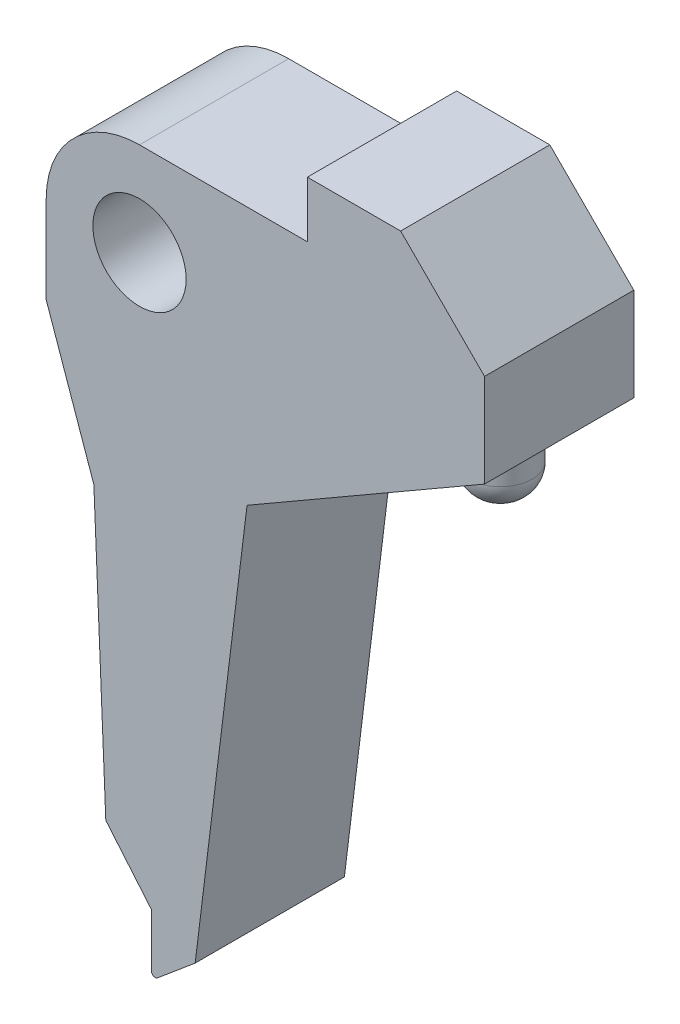
ISO-10303-21;
HEADER;
FILE_DESCRIPTION(('STEP AP214'),'2;1');
FILE_NAME('part.step','',(''),(''),'','','');
FILE_SCHEMA(('AUTOMOTIVE_DESIGN { 1 0 10303 214 1 1 1 1 }'));
ENDSEC;
DATA;
#1=APPLICATION_CONTEXT('core data for automotive mechanical design processes');
#2=APPLICATION_PROTOCOL_DEFINITION('international standard','automotive_design',2000,#1);
#3=PRODUCT_CONTEXT('',#1,'mechanical');
#4=PRODUCT('Part','Part','',(#3));
#5=PRODUCT_RELATED_PRODUCT_CATEGORY('part','',(#4));
#6=PRODUCT_DEFINITION_FORMATION('','',#4);
#7=PRODUCT_DEFINITION_CONTEXT('part definition',#1,'design');
#8=PRODUCT_DEFINITION('design','',#6,#7);
#9=PRODUCT_DEFINITION_SHAPE('','',#8);
#10=(LENGTH_UNIT() NAMED_UNIT(*) SI_UNIT(.MILLI.,.METRE.));
#11=(NAMED_UNIT(*) PLANE_ANGLE_UNIT() SI_UNIT($,.RADIAN.));
#12=(NAMED_UNIT(*) SI_UNIT($,.STERADIAN.) SOLID_ANGLE_UNIT());
#13=UNCERTAINTY_MEASURE_WITH_UNIT(LENGTH_MEASURE(1.E-05),#10,'distance_accuracy_value','');
#14=(GEOMETRIC_REPRESENTATION_CONTEXT(3) GLOBAL_UNCERTAINTY_ASSIGNED_CONTEXT((#13)) GLOBAL_UNIT_ASSIGNED_CONTEXT((#10,
#11,#12)) REPRESENTATION_CONTEXT('',''));
#15=CARTESIAN_POINT('',(0.,0.,0.));
#16=DIRECTION('',(0.,0.,1.));
#17=DIRECTION('',(1.,0.,0.));
#18=AXIS2_PLACEMENT_3D('',#15,#16,#17);
#19=CARTESIAN_POINT('',(0.839599880124929,-33.039815980547,8.));
#20=DIRECTION('',(0.,0.,-1.));
#21=DIRECTION('',(-1.,0.,0.));
#22=AXIS2_PLACEMENT_3D('',#19,#20,#21);
#23=PLANE('',#22);
#24=CARTESIAN_POINT('',(0.839599880124929,-33.039815980547,8.));
#25=DIRECTION('',(0.,0.,1.));
#26=DIRECTION('',(-1.,0.,0.));
#27=AXIS2_PLACEMENT_3D('',#24,#25,#26);
#28=CIRCLE('',#27,0.199999999999998);
#29=CARTESIAN_POINT('',(0.639599880124929,-33.039815980547,8.));
#30=VERTEX_POINT('',#29);
#31=CARTESIAN_POINT('',(0.968172025400115,-33.1930125975441,8.));
#32=VERTEX_POINT('',#31);
#33=EDGE_CURVE('E204',#30,#32,#28,.T.);
#34=ORIENTED_EDGE('',*,*,#33,.T.);
#35=DIRECTION('',(0.76598308498519,0.642860726375917,0.));
#36=VECTOR('',#35,1.);
#37=CARTESIAN_POINT('',(2.98543479971255,-31.5,8.));
#38=LINE('',#37,#36);
#39=CARTESIAN_POINT('',(2.98543479971255,-31.5,8.));
#40=VERTEX_POINT('',#39);
#41=EDGE_CURVE('E115',#32,#40,#38,.T.);
#42=ORIENTED_EDGE('',*,*,#41,.T.);
#43=DIRECTION('',(0.121869343405141,0.992546151641323,0.));
#44=VECTOR('',#43,1.);
#45=CARTESIAN_POINT('',(4.50077000284838,-19.1585851511559,8.));
#46=LINE('',#45,#44);
#47=CARTESIAN_POINT('',(5.76628220120397,-8.85181539891966,8.));
#48=VERTEX_POINT('',#47);
#49=EDGE_CURVE('E327',#40,#48,#46,.T.);
#50=ORIENTED_EDGE('',*,*,#49,.T.);
#51=DIRECTION('',(0.866025403784439,0.5,0.));
#52=VECTOR('',#51,1.);
#53=CARTESIAN_POINT('',(5.76628220120397,-8.85181539891966,8.));
#54=LINE('',#53,#52);
#55=CARTESIAN_POINT('',(18.5,-1.5,8.));
#56=VERTEX_POINT('',#55);
#57=EDGE_CURVE('E329',#48,#56,#54,.T.);
#58=ORIENTED_EDGE('',*,*,#57,.T.);
#59=DIRECTION('',(0.,1.,0.));
#60=VECTOR('',#59,1.);
#61=CARTESIAN_POINT('',(18.5,3.5,8.));
#62=LINE('',#61,#60);
#63=CARTESIAN_POINT('',(18.5,3.5,8.));
#64=VERTEX_POINT('',#63);
#65=EDGE_CURVE('E331',#56,#64,#62,.T.);
#66=ORIENTED_EDGE('',*,*,#65,.T.);
#67=DIRECTION('',(-0.707106781186551,0.707106781186544,0.));
#68=VECTOR('',#67,1.);
#69=CARTESIAN_POINT('',(14.,8.,8.));
#70=LINE('',#69,#68);
#71=CARTESIAN_POINT('',(14.,8.,8.));
#72=VERTEX_POINT('',#71);
#73=EDGE_CURVE('E337',#64,#72,#70,.T.);
#74=ORIENTED_EDGE('',*,*,#73,.T.);
#75=DIRECTION('',(-1.,0.,0.));
#76=VECTOR('',#75,1.);
#77=CARTESIAN_POINT('',(9.,8.,8.));
#78=LINE('',#77,#76);
#79=CARTESIAN_POINT('',(9.,8.,8.));
#80=VERTEX_POINT('',#79);
#81=EDGE_CURVE('E339',#72,#80,#78,.T.);
#82=ORIENTED_EDGE('',*,*,#81,.T.);
#83=DIRECTION('',(0.,-1.,0.));
#84=VECTOR('',#83,1.);
#85=CARTESIAN_POINT('',(9.,5.,8.));
#86=LINE('',#85,#84);
#87=CARTESIAN_POINT('',(9.,5.,8.));
#88=VERTEX_POINT('',#87);
#89=EDGE_CURVE('E341',#80,#88,#86,.T.);
#90=ORIENTED_EDGE('',*,*,#89,.T.);
#91=DIRECTION('',(-1.,0.,0.));
#92=VECTOR('',#91,1.);
#93=CARTESIAN_POINT('',(0.,5.,8.));
#94=LINE('',#93,#92);
#95=CARTESIAN_POINT('',(0.,5.,8.));
#96=VERTEX_POINT('',#95);
#97=EDGE_CURVE('E343',#88,#96,#94,.T.);
#98=ORIENTED_EDGE('',*,*,#97,.T.);
#99=CARTESIAN_POINT('',(0.,0.,8.));
#100=DIRECTION('',(0.,0.,1.));
#101=DIRECTION('',(1.,0.,0.));
#102=AXIS2_PLACEMENT_3D('',#99,#100,#101);
#103=CIRCLE('',#102,5.);
#104=CARTESIAN_POINT('',(-5.,0.,8.));
#105=VERTEX_POINT('',#104);
#106=EDGE_CURVE('E345',#96,#105,#103,.T.);
#107=ORIENTED_EDGE('',*,*,#106,.T.);
#108=DIRECTION('',(0.,-1.,0.));
#109=VECTOR('',#108,1.);
#110=CARTESIAN_POINT('',(-5.,-4.69657413374414,8.));
#111=LINE('',#110,#109);
#112=CARTESIAN_POINT('',(-5.,-4.69657413374414,8.));
#113=VERTEX_POINT('',#112);
#114=EDGE_CURVE('E347',#105,#113,#111,.T.);
#115=ORIENTED_EDGE('',*,*,#114,.T.);
#116=DIRECTION('',(0.330146334418636,-0.943929763208014,0.));
#117=VECTOR('',#116,1.);
#118=CARTESIAN_POINT('',(-2.44557341825096,-12.,8.));
#119=LINE('',#118,#117);
#120=CARTESIAN_POINT('',(-2.44557341825096,-12.,8.));
#121=VERTEX_POINT('',#120);
#122=EDGE_CURVE('E155',#113,#121,#119,.T.);
#123=ORIENTED_EDGE('',*,*,#122,.T.);
#124=DIRECTION('',(0.0418663292683817,-0.999123220865971,0.));
#125=VECTOR('',#124,1.);
#126=CARTESIAN_POINT('',(-1.8057349141197,-27.2694902622974,8.));
#127=LINE('',#126,#125);
#128=CARTESIAN_POINT('',(-1.8057349141197,-27.2694902622974,8.));
#129=VERTEX_POINT('',#128);
#130=EDGE_CURVE('E149',#121,#129,#127,.T.);
#131=ORIENTED_EDGE('',*,*,#130,.T.);
#132=DIRECTION('',(0.642787609686544,-0.766044443118974,0.));
#133=VECTOR('',#132,1.);
#134=CARTESIAN_POINT('',(0.639599880124929,-30.183726788434,8.));
#135=LINE('',#134,#133);
#136=CARTESIAN_POINT('',(0.639599880124929,-30.183726788434,8.));
#137=VERTEX_POINT('',#136);
#138=EDGE_CURVE('E153',#129,#137,#135,.T.);
#139=ORIENTED_EDGE('',*,*,#138,.T.);
#140=DIRECTION('',(0.,-1.,0.));
#141=VECTOR('',#140,1.);
#142=CARTESIAN_POINT('',(0.639599880124929,-33.039815980547,8.));
#143=LINE('',#142,#141);
#144=EDGE_CURVE('E50',#137,#30,#143,.T.);
#145=ORIENTED_EDGE('',*,*,#144,.T.);
#146=EDGE_LOOP('',(#34,#42,#50,#58,#66,#74,#82,#90,#98,#107,#115,#123,#131,#139,#145));
#147=FACE_BOUND('',#146,.T.);
#148=CARTESIAN_POINT('',(0.,0.,8.));
#149=DIRECTION('',(0.,0.,1.));
#150=DIRECTION('',(1.,0.,0.));
#151=AXIS2_PLACEMENT_3D('',#148,#149,#150);
#152=CIRCLE('',#151,2.5);
#153=CARTESIAN_POINT('',(2.5,0.,8.));
#154=VERTEX_POINT('',#153);
#155=EDGE_CURVE('E177',#154,#154,#152,.T.);
#156=ORIENTED_EDGE('',*,*,#155,.F.);
#157=EDGE_LOOP('',(#156));
#158=FACE_BOUND('',#157,.T.);
#159=ADVANCED_FACE('F33',(#147,#158),#23,.F.);
#160=CARTESIAN_POINT('',(0.839599880124929,-33.039815980547,0.));
#161=DIRECTION('',(0.,0.,-1.));
#162=DIRECTION('',(-1.,0.,0.));
#163=AXIS2_PLACEMENT_3D('',#160,#161,#162);
#164=PLANE('',#163);
#165=CARTESIAN_POINT('',(0.839599880124929,-33.039815980547,0.));
#166=DIRECTION('',(0.,0.,1.));
#167=DIRECTION('',(-1.,0.,0.));
#168=AXIS2_PLACEMENT_3D('',#165,#166,#167);
#169=CIRCLE('',#168,0.199999999999998);
#170=CARTESIAN_POINT('',(0.639599880124929,-33.039815980547,0.));
#171=VERTEX_POINT('',#170);
#172=CARTESIAN_POINT('',(0.968172025400115,-33.1930125975441,0.));
#173=VERTEX_POINT('',#172);
#174=EDGE_CURVE('E173',#171,#173,#169,.T.);
#175=ORIENTED_EDGE('',*,*,#174,.F.);
#176=DIRECTION('',(0.,-1.,0.));
#177=VECTOR('',#176,1.);
#178=CARTESIAN_POINT('',(0.639599880124929,-33.039815980547,0.));
#179=LINE('',#178,#177);
#180=CARTESIAN_POINT('',(0.639599880124929,-30.183726788434,0.));
#181=VERTEX_POINT('',#180);
#182=EDGE_CURVE('E106',#181,#171,#179,.T.);
#183=ORIENTED_EDGE('',*,*,#182,.F.);
#184=DIRECTION('',(0.642787609686544,-0.766044443118974,0.));
#185=VECTOR('',#184,1.);
#186=CARTESIAN_POINT('',(0.639599880124929,-30.183726788434,0.));
#187=LINE('',#186,#185);
#188=CARTESIAN_POINT('',(-1.8057349141197,-27.2694902622974,0.));
#189=VERTEX_POINT('',#188);
#190=EDGE_CURVE('E100',#189,#181,#187,.T.);
#191=ORIENTED_EDGE('',*,*,#190,.F.);
#192=DIRECTION('',(0.0418663292683817,-0.999123220865971,0.));
#193=VECTOR('',#192,1.);
#194=CARTESIAN_POINT('',(-1.8057349141197,-27.2694902622974,0.));
#195=LINE('',#194,#193);
#196=CARTESIAN_POINT('',(-2.44557341825096,-12.,0.));
#197=VERTEX_POINT('',#196);
#198=EDGE_CURVE('E163',#197,#189,#195,.T.);
#199=ORIENTED_EDGE('',*,*,#198,.F.);
#200=DIRECTION('',(0.330146334418636,-0.943929763208014,0.));
#201=VECTOR('',#200,1.);
#202=CARTESIAN_POINT('',(-2.44557341825096,-12.,0.));
#203=LINE('',#202,#201);
#204=CARTESIAN_POINT('',(-5.,-4.69657413374414,0.));
#205=VERTEX_POINT('',#204);
#206=EDGE_CURVE('E199',#205,#197,#203,.T.);
#207=ORIENTED_EDGE('',*,*,#206,.F.);
#208=DIRECTION('',(0.,-1.,0.));
#209=VECTOR('',#208,1.);
#210=CARTESIAN_POINT('',(-5.,-4.69657413374414,0.));
#211=LINE('',#210,#209);
#212=CARTESIAN_POINT('',(-5.,0.,0.));
#213=VERTEX_POINT('',#212);
#214=EDGE_CURVE('E197',#213,#205,#211,.T.);
#215=ORIENTED_EDGE('',*,*,#214,.F.);
#216=CARTESIAN_POINT('',(0.,0.,0.));
#217=DIRECTION('',(0.,0.,1.));
#218=DIRECTION('',(1.,0.,0.));
#219=AXIS2_PLACEMENT_3D('',#216,#217,#218);
#220=CIRCLE('',#219,5.);
#221=CARTESIAN_POINT('',(0.,5.,0.));
#222=VERTEX_POINT('',#221);
#223=EDGE_CURVE('E195',#222,#213,#220,.T.);
#224=ORIENTED_EDGE('',*,*,#223,.F.);
#225=DIRECTION('',(-1.,0.,0.));
#226=VECTOR('',#225,1.);
#227=CARTESIAN_POINT('',(0.,5.,0.));
#228=LINE('',#227,#226);
#229=CARTESIAN_POINT('',(9.,5.,0.));
#230=VERTEX_POINT('',#229);
#231=EDGE_CURVE('E193',#230,#222,#228,.T.);
#232=ORIENTED_EDGE('',*,*,#231,.F.);
#233=DIRECTION('',(0.,-1.,0.));
#234=VECTOR('',#233,1.);
#235=CARTESIAN_POINT('',(9.,5.,0.));
#236=LINE('',#235,#234);
#237=CARTESIAN_POINT('',(9.,8.,0.));
#238=VERTEX_POINT('',#237);
#239=EDGE_CURVE('E191',#238,#230,#236,.T.);
#240=ORIENTED_EDGE('',*,*,#239,.F.);
#241=DIRECTION('',(-1.,0.,0.));
#242=VECTOR('',#241,1.);
#243=CARTESIAN_POINT('',(9.,8.,0.));
#244=LINE('',#243,#242);
#245=CARTESIAN_POINT('',(14.,8.,0.));
#246=VERTEX_POINT('',#245);
#247=EDGE_CURVE('E189',#246,#238,#244,.T.);
#248=ORIENTED_EDGE('',*,*,#247,.F.);
#249=DIRECTION('',(-0.707106781186551,0.707106781186544,0.));
#250=VECTOR('',#249,1.);
#251=CARTESIAN_POINT('',(14.,8.,0.));
#252=LINE('',#251,#250);
#253=CARTESIAN_POINT('',(18.5,3.5,0.));
#254=VERTEX_POINT('',#253);
#255=EDGE_CURVE('E187',#254,#246,#252,.T.);
#256=ORIENTED_EDGE('',*,*,#255,.F.);
#257=DIRECTION('',(0.,1.,0.));
#258=VECTOR('',#257,1.);
#259=CARTESIAN_POINT('',(18.5,3.5,0.));
#260=LINE('',#259,#258);
#261=CARTESIAN_POINT('',(18.5,-1.5,0.));
#262=VERTEX_POINT('',#261);
#263=EDGE_CURVE('E185',#262,#254,#260,.T.);
#264=ORIENTED_EDGE('',*,*,#263,.F.);
#265=DIRECTION('',(0.866025403784438,0.500000000000002,0.));
#266=VECTOR('',#265,1.);
#267=CARTESIAN_POINT('',(18.5,-1.5,0.));
#268=LINE('',#267,#266);
#269=CARTESIAN_POINT('',(5.76628220120397,-8.85181539891966,0.));
#270=VERTEX_POINT('',#269);
#271=EDGE_CURVE('E183',#270,#262,#268,.T.);
#272=ORIENTED_EDGE('',*,*,#271,.F.);
#273=DIRECTION('',(0.121869343405141,0.992546151641323,0.));
#274=VECTOR('',#273,1.);
#275=CARTESIAN_POINT('',(4.50077000284838,-19.1585851511559,0.));
#276=LINE('',#275,#274);
#277=CARTESIAN_POINT('',(2.98543479971255,-31.5,0.));
#278=VERTEX_POINT('',#277);
#279=EDGE_CURVE('E180',#278,#270,#276,.T.);
#280=ORIENTED_EDGE('',*,*,#279,.F.);
#281=DIRECTION('',(0.76598308498519,0.642860726375917,0.));
#282=VECTOR('',#281,1.);
#283=CARTESIAN_POINT('',(2.98543479971255,-31.5,0.));
#284=LINE('',#283,#282);
#285=EDGE_CURVE('E176',#173,#278,#284,.T.);
#286=ORIENTED_EDGE('',*,*,#285,.F.);
#287=EDGE_LOOP('',(#175,#183,#191,#199,#207,#215,#224,#232,#240,#248,#256,#264,#272,#280,#286));
#288=FACE_BOUND('',#287,.T.);
#289=CARTESIAN_POINT('',(0.,0.,0.));
#290=DIRECTION('',(0.,0.,1.));
#291=DIRECTION('',(1.,0.,0.));
#292=AXIS2_PLACEMENT_3D('',#289,#290,#291);
#293=CIRCLE('',#292,2.5);
#294=CARTESIAN_POINT('',(2.5,0.,0.));
#295=VERTEX_POINT('',#294);
#296=EDGE_CURVE('E373',#295,#295,#293,.T.);
#297=ORIENTED_EDGE('',*,*,#296,.T.);
#298=EDGE_LOOP('',(#297));
#299=FACE_BOUND('',#298,.T.);
#300=ADVANCED_FACE('F256',(#288,#299),#164,.T.);
#301=CARTESIAN_POINT('',(0.839599880124929,-33.039815980547,8.));
#302=DIRECTION('',(0.,0.,-1.));
#303=DIRECTION('',(-1.,0.,0.));
#304=AXIS2_PLACEMENT_3D('',#301,#302,#303);
#305=CYLINDRICAL_SURFACE('',#304,0.199999999999998);
#306=ORIENTED_EDGE('',*,*,#174,.T.);
#307=DIRECTION('',(0.,0.,-1.));
#308=VECTOR('',#307,1.);
#309=CARTESIAN_POINT('',(0.968172025400115,-33.1930125975441,8.));
#310=LINE('',#309,#308);
#311=EDGE_CURVE('E238',#32,#173,#310,.T.);
#312=ORIENTED_EDGE('',*,*,#311,.F.);
#313=ORIENTED_EDGE('',*,*,#33,.F.);
#314=DIRECTION('',(0.,0.,-1.));
#315=VECTOR('',#314,1.);
#316=CARTESIAN_POINT('',(0.639599880124929,-33.039815980547,8.));
#317=LINE('',#316,#315);
#318=EDGE_CURVE('E169',#30,#171,#317,.T.);
#319=ORIENTED_EDGE('',*,*,#318,.T.);
#320=EDGE_LOOP('',(#306,#312,#313,#319));
#321=FACE_BOUND('',#320,.T.);
#322=ADVANCED_FACE('F261',(#321),#305,.T.);
#323=CARTESIAN_POINT('',(2.98543479971255,-31.5,8.));
#324=DIRECTION('',(-0.642860726375917,0.76598308498519,0.));
#325=DIRECTION('',(-0.76598308498519,-0.642860726375917,0.));
#326=AXIS2_PLACEMENT_3D('',#323,#324,#325);
#327=PLANE('',#326);
#328=ORIENTED_EDGE('',*,*,#285,.T.);
#329=DIRECTION('',(0.,0.,-1.));
#330=VECTOR('',#329,1.);
#331=CARTESIAN_POINT('',(2.98543479971255,-31.5,8.));
#332=LINE('',#331,#330);
#333=EDGE_CURVE('E235',#40,#278,#332,.T.);
#334=ORIENTED_EDGE('',*,*,#333,.F.);
#335=ORIENTED_EDGE('',*,*,#41,.F.);
#336=ORIENTED_EDGE('',*,*,#311,.T.);
#337=EDGE_LOOP('',(#328,#334,#335,#336));
#338=FACE_BOUND('',#337,.T.);
#339=ADVANCED_FACE('F314',(#338),#327,.F.);
#340=CARTESIAN_POINT('',(4.50077000284838,-19.1585851511559,8.));
#341=DIRECTION('',(-0.992546151641323,0.121869343405141,0.));
#342=DIRECTION('',(-0.121869343405141,-0.992546151641323,0.));
#343=AXIS2_PLACEMENT_3D('',#340,#341,#342);
#344=PLANE('',#343);
#345=ORIENTED_EDGE('',*,*,#279,.T.);
#346=DIRECTION('',(0.,0.,-1.));
#347=VECTOR('',#346,1.);
#348=CARTESIAN_POINT('',(5.76628220120397,-8.85181539891966,8.));
#349=LINE('',#348,#347);
#350=EDGE_CURVE('E232',#48,#270,#349,.T.);
#351=ORIENTED_EDGE('',*,*,#350,.F.);
#352=ORIENTED_EDGE('',*,*,#49,.F.);
#353=ORIENTED_EDGE('',*,*,#333,.T.);
#354=EDGE_LOOP('',(#345,#351,#352,#353));
#355=FACE_BOUND('',#354,.T.);
#356=ADVANCED_FACE('F310',(#355),#344,.F.);
#357=CARTESIAN_POINT('',(18.5,-1.5,8.));
#358=DIRECTION('',(-0.500000000000002,0.866025403784438,0.));
#359=DIRECTION('',(-0.866025403784438,-0.500000000000002,0.));
#360=AXIS2_PLACEMENT_3D('',#357,#358,#359);
#361=PLANE('',#360);
#362=CARTESIAN_POINT('',(15.3496087592222,-3.31887923091571,4.));
#363=DIRECTION('',(-0.500000000000002,0.866025403784438,0.));
#364=DIRECTION('',(0.866025403784438,0.500000000000002,0.));
#365=AXIS2_PLACEMENT_3D('',#362,#363,#364);
#366=ELLIPSE('',#365,2.88675134594813,2.5);
#367=CARTESIAN_POINT('',(17.8496087592222,-1.87550355794164,4.));
#368=VERTEX_POINT('',#367);
#369=EDGE_CURVE('E376',#368,#368,#366,.F.);
#370=ORIENTED_EDGE('',*,*,#369,.F.);
#371=EDGE_LOOP('',(#370));
#372=FACE_BOUND('',#371,.T.);
#373=ORIENTED_EDGE('',*,*,#271,.T.);
#374=DIRECTION('',(0.,0.,-1.));
#375=VECTOR('',#374,1.);
#376=CARTESIAN_POINT('',(18.5,-1.5,8.));
#377=LINE('',#376,#375);
#378=EDGE_CURVE('E229',#56,#262,#377,.T.);
#379=ORIENTED_EDGE('',*,*,#378,.F.);
#380=ORIENTED_EDGE('',*,*,#57,.F.);
#381=ORIENTED_EDGE('',*,*,#350,.T.);
#382=EDGE_LOOP('',(#373,#379,#380,#381));
#383=FACE_BOUND('',#382,.T.);
#384=ADVANCED_FACE('F306',(#372,#383),#361,.F.);
#385=CARTESIAN_POINT('',(18.5,3.5,8.));
#386=DIRECTION('',(-1.,0.,0.));
#387=DIRECTION('',(0.,0.,1.));
#388=AXIS2_PLACEMENT_3D('',#385,#386,#387);
#389=PLANE('',#388);
#390=ORIENTED_EDGE('',*,*,#263,.T.);
#391=DIRECTION('',(0.,0.,-1.));
#392=VECTOR('',#391,1.);
#393=CARTESIAN_POINT('',(18.5,3.5,8.));
#394=LINE('',#393,#392);
#395=EDGE_CURVE('E226',#64,#254,#394,.T.);
#396=ORIENTED_EDGE('',*,*,#395,.F.);
#397=ORIENTED_EDGE('',*,*,#65,.F.);
#398=ORIENTED_EDGE('',*,*,#378,.T.);
#399=EDGE_LOOP('',(#390,#396,#397,#398));
#400=FACE_BOUND('',#399,.T.);
#401=ADVANCED_FACE('F302',(#400),#389,.F.);
#402=CARTESIAN_POINT('',(14.,8.,8.));
#403=DIRECTION('',(-0.707106781186544,-0.707106781186552,0.));
#404=DIRECTION('',(0.707106781186552,-0.707106781186544,0.));
#405=AXIS2_PLACEMENT_3D('',#402,#403,#404);
#406=PLANE('',#405);
#407=ORIENTED_EDGE('',*,*,#255,.T.);
#408=DIRECTION('',(0.,0.,-1.));
#409=VECTOR('',#408,1.);
#410=CARTESIAN_POINT('',(14.,8.,8.));
#411=LINE('',#410,#409);
#412=EDGE_CURVE('E223',#72,#246,#411,.T.);
#413=ORIENTED_EDGE('',*,*,#412,.F.);
#414=ORIENTED_EDGE('',*,*,#73,.F.);
#415=ORIENTED_EDGE('',*,*,#395,.T.);
#416=EDGE_LOOP('',(#407,#413,#414,#415));
#417=FACE_BOUND('',#416,.T.);
#418=ADVANCED_FACE('F298',(#417),#406,.F.);
#419=CARTESIAN_POINT('',(9.,8.,8.));
#420=DIRECTION('',(0.,-1.,0.));
#421=DIRECTION('',(0.,0.,-1.));
#422=AXIS2_PLACEMENT_3D('',#419,#420,#421);
#423=PLANE('',#422);
#424=ORIENTED_EDGE('',*,*,#247,.T.);
#425=DIRECTION('',(0.,0.,-1.));
#426=VECTOR('',#425,1.);
#427=CARTESIAN_POINT('',(9.,8.,8.));
#428=LINE('',#427,#426);
#429=EDGE_CURVE('E220',#80,#238,#428,.T.);
#430=ORIENTED_EDGE('',*,*,#429,.F.);
#431=ORIENTED_EDGE('',*,*,#81,.F.);
#432=ORIENTED_EDGE('',*,*,#412,.T.);
#433=EDGE_LOOP('',(#424,#430,#431,#432));
#434=FACE_BOUND('',#433,.T.);
#435=ADVANCED_FACE('F294',(#434),#423,.F.);
#436=CARTESIAN_POINT('',(9.,5.,8.));
#437=DIRECTION('',(1.,0.,0.));
#438=DIRECTION('',(0.,0.,-1.));
#439=AXIS2_PLACEMENT_3D('',#436,#437,#438);
#440=PLANE('',#439);
#441=ORIENTED_EDGE('',*,*,#239,.T.);
#442=DIRECTION('',(0.,0.,-1.));
#443=VECTOR('',#442,1.);
#444=CARTESIAN_POINT('',(9.,5.,8.));
#445=LINE('',#444,#443);
#446=EDGE_CURVE('E217',#88,#230,#445,.T.);
#447=ORIENTED_EDGE('',*,*,#446,.F.);
#448=ORIENTED_EDGE('',*,*,#89,.F.);
#449=ORIENTED_EDGE('',*,*,#429,.T.);
#450=EDGE_LOOP('',(#441,#447,#448,#449));
#451=FACE_BOUND('',#450,.T.);
#452=ADVANCED_FACE('F290',(#451),#440,.F.);
#453=CARTESIAN_POINT('',(0.,5.,8.));
#454=DIRECTION('',(0.,-1.,0.));
#455=DIRECTION('',(0.,0.,-1.));
#456=AXIS2_PLACEMENT_3D('',#453,#454,#455);
#457=PLANE('',#456);
#458=ORIENTED_EDGE('',*,*,#231,.T.);
#459=DIRECTION('',(0.,0.,-1.));
#460=VECTOR('',#459,1.);
#461=CARTESIAN_POINT('',(0.,5.,8.));
#462=LINE('',#461,#460);
#463=EDGE_CURVE('E214',#96,#222,#462,.T.);
#464=ORIENTED_EDGE('',*,*,#463,.F.);
#465=ORIENTED_EDGE('',*,*,#97,.F.);
#466=ORIENTED_EDGE('',*,*,#446,.T.);
#467=EDGE_LOOP('',(#458,#464,#465,#466));
#468=FACE_BOUND('',#467,.T.);
#469=ADVANCED_FACE('F286',(#468),#457,.F.);
#470=CARTESIAN_POINT('',(0.,0.,8.));
#471=DIRECTION('',(0.,0.,-1.));
#472=DIRECTION('',(-1.,0.,0.));
#473=AXIS2_PLACEMENT_3D('',#470,#471,#472);
#474=CYLINDRICAL_SURFACE('',#473,5.);
#475=ORIENTED_EDGE('',*,*,#223,.T.);
#476=DIRECTION('',(0.,0.,-1.));
#477=VECTOR('',#476,1.);
#478=CARTESIAN_POINT('',(-5.,0.,8.));
#479=LINE('',#478,#477);
#480=EDGE_CURVE('E211',#105,#213,#479,.T.);
#481=ORIENTED_EDGE('',*,*,#480,.F.);
#482=ORIENTED_EDGE('',*,*,#106,.F.);
#483=ORIENTED_EDGE('',*,*,#463,.T.);
#484=EDGE_LOOP('',(#475,#481,#482,#483));
#485=FACE_BOUND('',#484,.T.);
#486=ADVANCED_FACE('F282',(#485),#474,.T.);
#487=CARTESIAN_POINT('',(-5.,-4.69657413374414,8.));
#488=DIRECTION('',(1.,0.,0.));
#489=DIRECTION('',(0.,0.,-1.));
#490=AXIS2_PLACEMENT_3D('',#487,#488,#489);
#491=PLANE('',#490);
#492=ORIENTED_EDGE('',*,*,#214,.T.);
#493=DIRECTION('',(0.,0.,-1.));
#494=VECTOR('',#493,1.);
#495=CARTESIAN_POINT('',(-5.,-4.69657413374414,8.));
#496=LINE('',#495,#494);
#497=EDGE_CURVE('E208',#113,#205,#496,.T.);
#498=ORIENTED_EDGE('',*,*,#497,.F.);
#499=ORIENTED_EDGE('',*,*,#114,.F.);
#500=ORIENTED_EDGE('',*,*,#480,.T.);
#501=EDGE_LOOP('',(#492,#498,#499,#500));
#502=FACE_BOUND('',#501,.T.);
#503=ADVANCED_FACE('F278',(#502),#491,.F.);
#504=CARTESIAN_POINT('',(-2.44557341825096,-12.,8.));
#505=DIRECTION('',(0.943929763208014,0.330146334418636,0.));
#506=DIRECTION('',(-0.330146334418636,0.943929763208014,0.));
#507=AXIS2_PLACEMENT_3D('',#504,#505,#506);
#508=PLANE('',#507);
#509=ORIENTED_EDGE('',*,*,#206,.T.);
#510=DIRECTION('',(0.,0.,-1.));
#511=VECTOR('',#510,1.);
#512=CARTESIAN_POINT('',(-2.44557341825096,-12.,8.));
#513=LINE('',#512,#511);
#514=EDGE_CURVE('E164',#121,#197,#513,.T.);
#515=ORIENTED_EDGE('',*,*,#514,.F.);
#516=ORIENTED_EDGE('',*,*,#122,.F.);
#517=ORIENTED_EDGE('',*,*,#497,.T.);
#518=EDGE_LOOP('',(#509,#515,#516,#517));
#519=FACE_BOUND('',#518,.T.);
#520=ADVANCED_FACE('F275',(#519),#508,.F.);
#521=CARTESIAN_POINT('',(-1.8057349141197,-27.2694902622974,8.));
#522=DIRECTION('',(0.999123220865971,0.0418663292683817,0.));
#523=DIRECTION('',(-0.0418663292683817,0.999123220865971,0.));
#524=AXIS2_PLACEMENT_3D('',#521,#522,#523);
#525=PLANE('',#524);
#526=ORIENTED_EDGE('',*,*,#198,.T.);
#527=DIRECTION('',(0.,0.,-1.));
#528=VECTOR('',#527,1.);
#529=CARTESIAN_POINT('',(-1.8057349141197,-27.2694902622974,8.));
#530=LINE('',#529,#528);
#531=EDGE_CURVE('E160',#129,#189,#530,.T.);
#532=ORIENTED_EDGE('',*,*,#531,.F.);
#533=ORIENTED_EDGE('',*,*,#130,.F.);
#534=ORIENTED_EDGE('',*,*,#514,.T.);
#535=EDGE_LOOP('',(#526,#532,#533,#534));
#536=FACE_BOUND('',#535,.T.);
#537=ADVANCED_FACE('F161',(#536),#525,.F.);
#538=CARTESIAN_POINT('',(0.639599880124929,-30.183726788434,8.));
#539=DIRECTION('',(0.766044443118974,0.642787609686544,0.));
#540=DIRECTION('',(-0.642787609686544,0.766044443118974,0.));
#541=AXIS2_PLACEMENT_3D('',#538,#539,#540);
#542=PLANE('',#541);
#543=ORIENTED_EDGE('',*,*,#190,.T.);
#544=DIRECTION('',(0.,0.,-1.));
#545=VECTOR('',#544,1.);
#546=CARTESIAN_POINT('',(0.639599880124929,-30.183726788434,8.));
#547=LINE('',#546,#545);
#548=EDGE_CURVE('E165',#137,#181,#547,.T.);
#549=ORIENTED_EDGE('',*,*,#548,.F.);
#550=ORIENTED_EDGE('',*,*,#138,.F.);
#551=ORIENTED_EDGE('',*,*,#531,.T.);
#552=EDGE_LOOP('',(#543,#549,#550,#551));
#553=FACE_BOUND('',#552,.T.);
#554=ADVANCED_FACE('F167',(#553),#542,.F.);
#555=CARTESIAN_POINT('',(0.639599880124929,-33.039815980547,8.));
#556=DIRECTION('',(1.,0.,0.));
#557=DIRECTION('',(0.,0.,-1.));
#558=AXIS2_PLACEMENT_3D('',#555,#556,#557);
#559=PLANE('',#558);
#560=ORIENTED_EDGE('',*,*,#182,.T.);
#561=ORIENTED_EDGE('',*,*,#318,.F.);
#562=ORIENTED_EDGE('',*,*,#144,.F.);
#563=ORIENTED_EDGE('',*,*,#548,.T.);
#564=EDGE_LOOP('',(#560,#561,#562,#563));
#565=FACE_BOUND('',#564,.T.);
#566=ADVANCED_FACE('F268',(#565),#559,.F.);
#567=CARTESIAN_POINT('',(0.,0.,8.));
#568=DIRECTION('',(0.,0.,-1.));
#569=DIRECTION('',(-1.,0.,0.));
#570=AXIS2_PLACEMENT_3D('',#567,#568,#569);
#571=CYLINDRICAL_SURFACE('',#570,2.5);
#572=ORIENTED_EDGE('',*,*,#155,.T.);
#573=EDGE_LOOP('',(#572));
#574=FACE_BOUND('',#573,.T.);
#575=ORIENTED_EDGE('',*,*,#296,.F.);
#576=EDGE_LOOP('',(#575));
#577=FACE_BOUND('',#576,.T.);
#578=ADVANCED_FACE('F265',(#574,#577),#571,.F.);
#579=CARTESIAN_POINT('',(15.3496087592222,-33.240815980547,4.));
#580=DIRECTION('',(0.,1.,0.));
#581=DIRECTION('',(0.,0.,1.));
#582=AXIS2_PLACEMENT_3D('',#579,#580,#581);
#583=CYLINDRICAL_SURFACE('',#582,2.5);
#584=CARTESIAN_POINT('',(15.3496087592222,-1.5,4.));
#585=DIRECTION('',(0.,1.,0.));
#586=DIRECTION('',(0.,0.,1.));
#587=AXIS2_PLACEMENT_3D('',#584,#585,#586);
#588=CIRCLE('',#587,2.5);
#589=CARTESIAN_POINT('',(15.3496087592222,-1.5,6.5));
#590=VERTEX_POINT('',#589);
#591=EDGE_CURVE('E381',#590,#590,#588,.T.);
#592=ORIENTED_EDGE('',*,*,#591,.T.);
#593=EDGE_LOOP('',(#592));
#594=FACE_BOUND('',#593,.T.);
#595=ORIENTED_EDGE('',*,*,#369,.T.);
#596=EDGE_LOOP('',(#595));
#597=FACE_BOUND('',#596,.T.);
#598=ADVANCED_FACE('F385',(#594,#597),#583,.F.);
#599=CARTESIAN_POINT('',(15.3496087592222,-1.5,4.));
#600=DIRECTION('',(0.,1.,0.));
#601=DIRECTION('',(0.,0.,1.));
#602=AXIS2_PLACEMENT_3D('',#599,#600,#601);
#603=PLANE('',#602);
#604=CARTESIAN_POINT('',(15.3496087592222,-1.5,4.));
#605=DIRECTION('',(0.,1.,0.));
#606=DIRECTION('',(0.,0.,1.));
#607=AXIS2_PLACEMENT_3D('',#604,#605,#606);
#608=CIRCLE('',#607,1.7);
#609=CARTESIAN_POINT('',(15.3496087592222,-1.5,5.7));
#610=VERTEX_POINT('',#609);
#611=EDGE_CURVE('E240',#610,#610,#608,.F.);
#612=ORIENTED_EDGE('',*,*,#611,.F.);
#613=EDGE_LOOP('',(#612));
#614=FACE_BOUND('',#613,.T.);
#615=ORIENTED_EDGE('',*,*,#591,.F.);
#616=EDGE_LOOP('',(#615));
#617=FACE_BOUND('',#616,.T.);
#618=ADVANCED_FACE('F388',(#614,#617),#603,.F.);
#619=CARTESIAN_POINT('',(15.3496087592222,-5.5,4.));
#620=DIRECTION('',(0.,1.,0.));
#621=DIRECTION('',(0.,0.,1.));
#622=AXIS2_PLACEMENT_3D('',#619,#620,#621);
#623=CYLINDRICAL_SURFACE('',#622,1.7);
#624=CARTESIAN_POINT('',(15.3496087592222,-4.,4.));
#625=DIRECTION('',(0.,-1.,0.));
#626=DIRECTION('',(0.,0.,-1.));
#627=AXIS2_PLACEMENT_3D('',#624,#625,#626);
#628=CIRCLE('',#627,1.7);
#629=CARTESIAN_POINT('',(15.3496087592222,-4.,2.3));
#630=VERTEX_POINT('',#629);
#631=EDGE_CURVE('E11',#630,#630,#628,.F.);
#632=ORIENTED_EDGE('',*,*,#631,.T.);
#633=EDGE_LOOP('',(#632));
#634=FACE_BOUND('',#633,.T.);
#635=ORIENTED_EDGE('',*,*,#611,.T.);
#636=EDGE_LOOP('',(#635));
#637=FACE_BOUND('',#636,.T.);
#638=ADVANCED_FACE('F252',(#634,#637),#623,.T.);
#639=CARTESIAN_POINT('',(15.3496087592222,-5.5,4.));
#640=DIRECTION('',(0.,-1.,0.));
#641=DIRECTION('',(0.,0.,-1.));
#642=AXIS2_PLACEMENT_3D('',#639,#640,#641);
#643=PLANE('',#642);
#644=CARTESIAN_POINT('',(15.3496087592222,-5.5,4.));
#645=DIRECTION('',(0.,-1.,0.));
#646=DIRECTION('',(0.,0.,-1.));
#647=AXIS2_PLACEMENT_3D('',#644,#645,#646);
#648=CIRCLE('',#647,0.199999999999998);
#649=CARTESIAN_POINT('',(15.3496087592222,-5.5,3.8));
#650=VERTEX_POINT('',#649);
#651=EDGE_CURVE('E42',#650,#650,#648,.T.);
#652=ORIENTED_EDGE('',*,*,#651,.T.);
#653=EDGE_LOOP('',(#652));
#654=FACE_BOUND('',#653,.T.);
#655=ADVANCED_FACE('F245',(#654),#643,.T.);
#656=CARTESIAN_POINT('',(15.3496087592222,-4.,4.));
#657=DIRECTION('',(0.,-1.,0.));
#658=DIRECTION('',(0.,0.,-1.));
#659=AXIS2_PLACEMENT_3D('',#656,#657,#658);
#660=DEGENERATE_TOROIDAL_SURFACE('',#659,0.199999999999998,1.5,.T.);
#661=ORIENTED_EDGE('',*,*,#631,.F.);
#662=EDGE_LOOP('',(#661));
#663=FACE_BOUND('',#662,.T.);
#664=ORIENTED_EDGE('',*,*,#651,.F.);
#665=EDGE_LOOP('',(#664));
#666=FACE_BOUND('',#665,.T.);
#667=ADVANCED_FACE('F35',(#663,#666),#660,.T.);
#668=CLOSED_SHELL('',(#159,#300,#322,#339,#356,#384,#401,#418,#435,#452,#469,#486,#503,#520,
#537,#554,#566,#578,#598,#618,#638,#655,#667));
#669=MANIFOLD_SOLID_BREP('B2',#668);
#670=ADVANCED_BREP_SHAPE_REPRESENTATION('',(#18,#669),#14);
#671=SHAPE_DEFINITION_REPRESENTATION(#9,#670);
ENDSEC;
END-ISO-10303-21;
